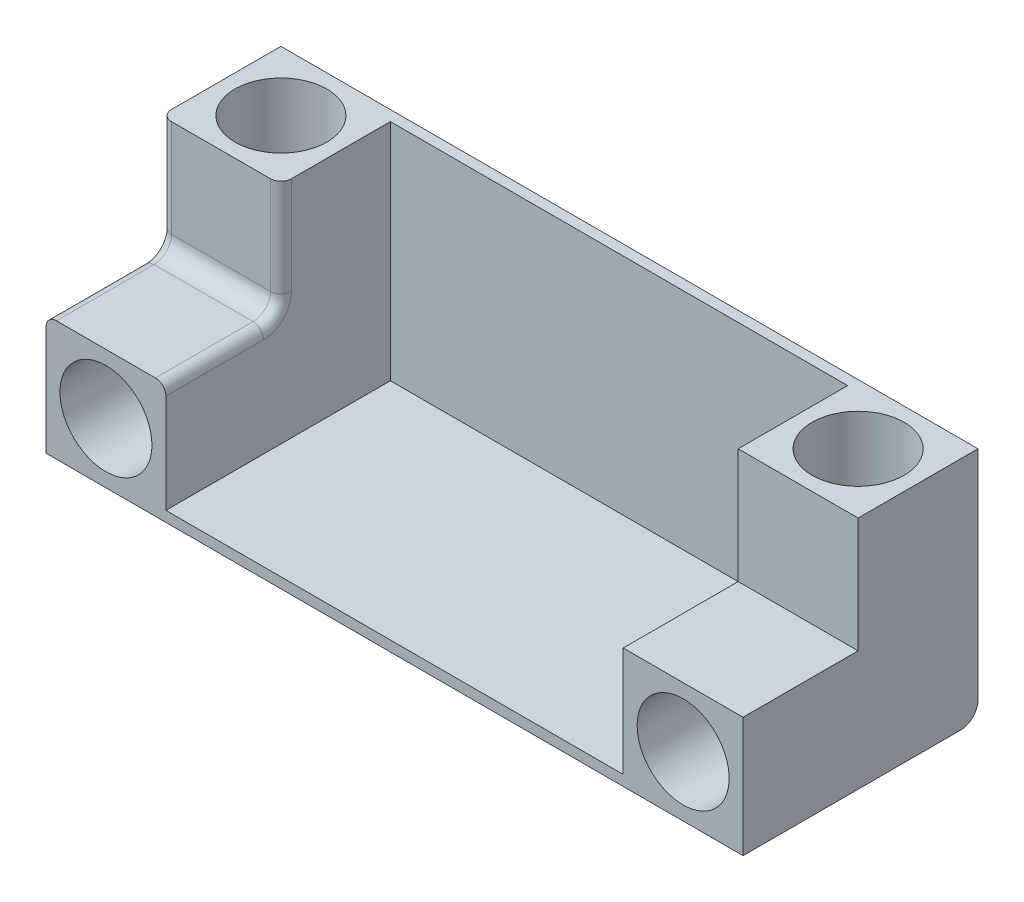
ISO-10303-21;
HEADER;
FILE_DESCRIPTION(('STEP AP214'),'2;1');
FILE_NAME('part.step','',(''),(''),'','','');
FILE_SCHEMA(('AUTOMOTIVE_DESIGN { 1 0 10303 214 1 1 1 1 }'));
ENDSEC;
DATA;
#1=APPLICATION_CONTEXT('core data for automotive mechanical design processes');
#2=APPLICATION_PROTOCOL_DEFINITION('international standard','automotive_design',2000,#1);
#3=PRODUCT_CONTEXT('',#1,'mechanical');
#4=PRODUCT('Part','Part','',(#3));
#5=PRODUCT_RELATED_PRODUCT_CATEGORY('part','',(#4));
#6=PRODUCT_DEFINITION_FORMATION('','',#4);
#7=PRODUCT_DEFINITION_CONTEXT('part definition',#1,'design');
#8=PRODUCT_DEFINITION('design','',#6,#7);
#9=PRODUCT_DEFINITION_SHAPE('','',#8);
#10=(LENGTH_UNIT() NAMED_UNIT(*) SI_UNIT(.MILLI.,.METRE.));
#11=(NAMED_UNIT(*) PLANE_ANGLE_UNIT() SI_UNIT($,.RADIAN.));
#12=(NAMED_UNIT(*) SI_UNIT($,.STERADIAN.) SOLID_ANGLE_UNIT());
#13=UNCERTAINTY_MEASURE_WITH_UNIT(LENGTH_MEASURE(1.E-05),#10,'distance_accuracy_value','');
#14=(GEOMETRIC_REPRESENTATION_CONTEXT(3) GLOBAL_UNCERTAINTY_ASSIGNED_CONTEXT((#13)) GLOBAL_UNIT_ASSIGNED_CONTEXT((#10,
#11,#12)) REPRESENTATION_CONTEXT('',''));
#15=CARTESIAN_POINT('',(0.,0.,0.));
#16=DIRECTION('',(0.,0.,1.));
#17=DIRECTION('',(1.,0.,0.));
#18=AXIS2_PLACEMENT_3D('',#15,#16,#17);
#19=CARTESIAN_POINT('',(150.,55.,0.));
#20=DIRECTION('',(-1.,0.,0.));
#21=DIRECTION('',(0.,0.,1.));
#22=AXIS2_PLACEMENT_3D('',#19,#20,#21);
#23=PLANE('',#22);
#24=DIRECTION('',(0.,0.,-1.));
#25=VECTOR('',#24,1.);
#26=CARTESIAN_POINT('',(150.,0.,0.));
#27=LINE('',#26,#25);
#28=CARTESIAN_POINT('',(150.,0.,39.8999999999999));
#29=VERTEX_POINT('',#28);
#30=CARTESIAN_POINT('',(150.,0.,-22.5));
#31=VERTEX_POINT('',#30);
#32=EDGE_CURVE('E166',#29,#31,#27,.T.);
#33=ORIENTED_EDGE('',*,*,#32,.T.);
#34=CARTESIAN_POINT('',(150.,5.,-22.5));
#35=DIRECTION('',(-1.,0.,0.));
#36=DIRECTION('',(0.,0.,1.));
#37=AXIS2_PLACEMENT_3D('',#34,#35,#36);
#38=CIRCLE('',#37,5.);
#39=CARTESIAN_POINT('',(150.,5.,-27.5000000000001));
#40=VERTEX_POINT('',#39);
#41=EDGE_CURVE('E282',#31,#40,#38,.F.);
#42=ORIENTED_EDGE('',*,*,#41,.T.);
#43=DIRECTION('',(0.,-1.,0.));
#44=VECTOR('',#43,1.);
#45=CARTESIAN_POINT('',(150.,55.,-27.5000000000001));
#46=LINE('',#45,#44);
#47=CARTESIAN_POINT('',(150.,67.4,-27.5000000000001));
#48=VERTEX_POINT('',#47);
#49=EDGE_CURVE('E175',#48,#40,#46,.T.);
#50=ORIENTED_EDGE('',*,*,#49,.F.);
#51=DIRECTION('',(0.,0.,1.));
#52=VECTOR('',#51,1.);
#53=CARTESIAN_POINT('',(150.,67.4,-27.5000000000001));
#54=LINE('',#53,#52);
#55=CARTESIAN_POINT('',(150.,67.4,6.89999999999988));
#56=VERTEX_POINT('',#55);
#57=EDGE_CURVE('E209',#48,#56,#54,.T.);
#58=ORIENTED_EDGE('',*,*,#57,.T.);
#59=DIRECTION('',(0.,-1.,0.));
#60=VECTOR('',#59,1.);
#61=CARTESIAN_POINT('',(150.,55.,6.89999999999988));
#62=LINE('',#61,#60);
#63=CARTESIAN_POINT('',(150.,34.4,6.89999999999989));
#64=VERTEX_POINT('',#63);
#65=EDGE_CURVE('E219',#56,#64,#62,.T.);
#66=ORIENTED_EDGE('',*,*,#65,.T.);
#67=DIRECTION('',(0.,0.,1.));
#68=VECTOR('',#67,1.);
#69=CARTESIAN_POINT('',(150.,34.4,27.4999999999999));
#70=LINE('',#69,#68);
#71=CARTESIAN_POINT('',(150.,34.4,39.8999999999999));
#72=VERTEX_POINT('',#71);
#73=EDGE_CURVE('E193',#64,#72,#70,.T.);
#74=ORIENTED_EDGE('',*,*,#73,.T.);
#75=DIRECTION('',(0.,-1.,0.));
#76=VECTOR('',#75,1.);
#77=CARTESIAN_POINT('',(150.,34.4,39.8999999999999));
#78=LINE('',#77,#76);
#79=EDGE_CURVE('E184',#72,#29,#78,.T.);
#80=ORIENTED_EDGE('',*,*,#79,.T.);
#81=EDGE_LOOP('',(#33,#42,#50,#58,#66,#74,#80));
#82=FACE_BOUND('',#81,.T.);
#83=ADVANCED_FACE('F37',(#82),#23,.F.);
#84=CARTESIAN_POINT('',(115.6,3.,-24.5000000000001));
#85=DIRECTION('',(-1.,0.,0.));
#86=DIRECTION('',(0.,0.,1.));
#87=AXIS2_PLACEMENT_3D('',#84,#85,#86);
#88=PLANE('',#87);
#89=DIRECTION('',(0.,0.,-1.));
#90=VECTOR('',#89,1.);
#91=CARTESIAN_POINT('',(115.6,34.4,-24.5000000000001));
#92=LINE('',#91,#90);
#93=CARTESIAN_POINT('',(115.6,34.4,39.8999999999999));
#94=VERTEX_POINT('',#93);
#95=CARTESIAN_POINT('',(115.6,34.4,6.89999999999989));
#96=VERTEX_POINT('',#95);
#97=EDGE_CURVE('E276',#94,#96,#92,.T.);
#98=ORIENTED_EDGE('',*,*,#97,.T.);
#99=DIRECTION('',(0.,1.,0.));
#100=VECTOR('',#99,1.);
#101=CARTESIAN_POINT('',(115.6,3.00000000000001,6.89999999999992));
#102=LINE('',#101,#100);
#103=CARTESIAN_POINT('',(115.6,67.4,6.89999999999992));
#104=VERTEX_POINT('',#103);
#105=EDGE_CURVE('E279',#96,#104,#102,.T.);
#106=ORIENTED_EDGE('',*,*,#105,.T.);
#107=DIRECTION('',(0.,0.,-1.));
#108=VECTOR('',#107,1.);
#109=CARTESIAN_POINT('',(115.6,67.4,6.89999999999992));
#110=LINE('',#109,#108);
#111=CARTESIAN_POINT('',(115.6,67.4,-24.5000000000001));
#112=VERTEX_POINT('',#111);
#113=EDGE_CURVE('E212',#104,#112,#110,.T.);
#114=ORIENTED_EDGE('',*,*,#113,.T.);
#115=DIRECTION('',(0.,1.,0.));
#116=VECTOR('',#115,1.);
#117=CARTESIAN_POINT('',(115.6,3.,-24.5000000000001));
#118=LINE('',#117,#116);
#119=CARTESIAN_POINT('',(115.6,3.,-24.5000000000001));
#120=VERTEX_POINT('',#119);
#121=EDGE_CURVE('E176',#120,#112,#118,.T.);
#122=ORIENTED_EDGE('',*,*,#121,.F.);
#123=DIRECTION('',(0.,0.,1.));
#124=VECTOR('',#123,1.);
#125=CARTESIAN_POINT('',(115.6,3.,-24.5000000000001));
#126=LINE('',#125,#124);
#127=CARTESIAN_POINT('',(115.6,3.,39.8999999999999));
#128=VERTEX_POINT('',#127);
#129=EDGE_CURVE('E226',#120,#128,#126,.T.);
#130=ORIENTED_EDGE('',*,*,#129,.T.);
#131=DIRECTION('',(0.,1.,0.));
#132=VECTOR('',#131,1.);
#133=CARTESIAN_POINT('',(115.6,3.,39.8999999999999));
#134=LINE('',#133,#132);
#135=EDGE_CURVE('E197',#128,#94,#134,.T.);
#136=ORIENTED_EDGE('',*,*,#135,.T.);
#137=EDGE_LOOP('',(#98,#106,#114,#122,#130,#136));
#138=FACE_BOUND('',#137,.T.);
#139=ADVANCED_FACE('F357',(#138),#88,.T.);
#140=CARTESIAN_POINT('',(0.,55.,-27.5));
#141=DIRECTION('',(0.,0.,-1.));
#142=DIRECTION('',(-1.,0.,0.));
#143=AXIS2_PLACEMENT_3D('',#140,#141,#142);
#144=PLANE('',#143);
#145=ORIENTED_EDGE('',*,*,#49,.T.);
#146=DIRECTION('',(1.,0.,0.));
#147=VECTOR('',#146,1.);
#148=CARTESIAN_POINT('',(-50.,5.,-27.5000000000001));
#149=LINE('',#148,#147);
#150=CARTESIAN_POINT('',(-50.,5.,-27.5000000000001));
#151=VERTEX_POINT('',#150);
#152=EDGE_CURVE('E284',#40,#151,#149,.F.);
#153=ORIENTED_EDGE('',*,*,#152,.T.);
#154=DIRECTION('',(0.,-1.,0.));
#155=VECTOR('',#154,1.);
#156=CARTESIAN_POINT('',(-50.,55.,-27.5000000000001));
#157=LINE('',#156,#155);
#158=CARTESIAN_POINT('',(-50.,67.4,-27.5000000000001));
#159=VERTEX_POINT('',#158);
#160=EDGE_CURVE('E270',#159,#151,#157,.T.);
#161=ORIENTED_EDGE('',*,*,#160,.F.);
#162=DIRECTION('',(-1.,0.,0.));
#163=VECTOR('',#162,1.);
#164=CARTESIAN_POINT('',(50.,67.4,-27.5));
#165=LINE('',#164,#163);
#166=EDGE_CURVE('E254',#48,#159,#165,.T.);
#167=ORIENTED_EDGE('',*,*,#166,.F.);
#168=EDGE_LOOP('',(#145,#153,#161,#167));
#169=FACE_BOUND('',#168,.T.);
#170=ADVANCED_FACE('F367',(#169),#144,.T.);
#171=CARTESIAN_POINT('',(-50.,55.,0.));
#172=DIRECTION('',(-1.,0.,0.));
#173=DIRECTION('',(0.,0.,1.));
#174=AXIS2_PLACEMENT_3D('',#171,#172,#173);
#175=PLANE('',#174);
#176=DIRECTION('',(0.,-1.,0.));
#177=VECTOR('',#176,1.);
#178=CARTESIAN_POINT('',(-50.,34.4,39.8999999999999));
#179=LINE('',#178,#177);
#180=CARTESIAN_POINT('',(-50.,31.4,39.8999999999999));
#181=VERTEX_POINT('',#180);
#182=CARTESIAN_POINT('',(-50.,0.,39.8999999999999));
#183=VERTEX_POINT('',#182);
#184=EDGE_CURVE('E187',#181,#183,#179,.T.);
#185=ORIENTED_EDGE('',*,*,#184,.F.);
#186=DIRECTION('',(0.,0.,1.));
#187=VECTOR('',#186,1.);
#188=CARTESIAN_POINT('',(-50.,31.4,11.8999999999999));
#189=LINE('',#188,#187);
#190=CARTESIAN_POINT('',(-50.,31.4,11.8999999999999));
#191=VERTEX_POINT('',#190);
#192=EDGE_CURVE('E301',#181,#191,#189,.F.);
#193=ORIENTED_EDGE('',*,*,#192,.T.);
#194=CARTESIAN_POINT('',(-50.,39.4,11.8999999999999));
#195=DIRECTION('',(-1.,0.,0.));
#196=DIRECTION('',(0.,0.,1.));
#197=AXIS2_PLACEMENT_3D('',#194,#195,#196);
#198=CIRCLE('',#197,8.);
#199=CARTESIAN_POINT('',(-50.,39.4,3.89999999999994));
#200=VERTEX_POINT('',#199);
#201=EDGE_CURVE('E299',#191,#200,#198,.F.);
#202=ORIENTED_EDGE('',*,*,#201,.T.);
#203=DIRECTION('',(0.,-1.,0.));
#204=VECTOR('',#203,1.);
#205=CARTESIAN_POINT('',(-50.,67.4,3.89999999999994));
#206=LINE('',#205,#204);
#207=CARTESIAN_POINT('',(-50.,67.4,3.89999999999992));
#208=VERTEX_POINT('',#207);
#209=EDGE_CURVE('E297',#200,#208,#206,.F.);
#210=ORIENTED_EDGE('',*,*,#209,.T.);
#211=DIRECTION('',(0.,0.,1.));
#212=VECTOR('',#211,1.);
#213=CARTESIAN_POINT('',(-50.,67.4,-27.5000000000001));
#214=LINE('',#213,#212);
#215=EDGE_CURVE('E244',#159,#208,#214,.T.);
#216=ORIENTED_EDGE('',*,*,#215,.F.);
#217=ORIENTED_EDGE('',*,*,#160,.T.);
#218=CARTESIAN_POINT('',(-50.,5.,-22.5000000000001));
#219=DIRECTION('',(-1.,0.,0.));
#220=DIRECTION('',(0.,0.,1.));
#221=AXIS2_PLACEMENT_3D('',#218,#219,#220);
#222=CIRCLE('',#221,5.);
#223=CARTESIAN_POINT('',(-50.,0.,-22.5000000000001));
#224=VERTEX_POINT('',#223);
#225=EDGE_CURVE('E286',#151,#224,#222,.T.);
#226=ORIENTED_EDGE('',*,*,#225,.T.);
#227=DIRECTION('',(0.,0.,-1.));
#228=VECTOR('',#227,1.);
#229=CARTESIAN_POINT('',(-50.,0.,0.));
#230=LINE('',#229,#228);
#231=EDGE_CURVE('E268',#183,#224,#230,.T.);
#232=ORIENTED_EDGE('',*,*,#231,.F.);
#233=EDGE_LOOP('',(#185,#193,#202,#210,#216,#217,#226,#232));
#234=FACE_BOUND('',#233,.T.);
#235=ADVANCED_FACE('F370',(#234),#175,.T.);
#236=CARTESIAN_POINT('',(0.,0.,0.));
#237=DIRECTION('',(0.,1.,0.));
#238=DIRECTION('',(0.,0.,1.));
#239=AXIS2_PLACEMENT_3D('',#236,#237,#238);
#240=PLANE('',#239);
#241=ORIENTED_EDGE('',*,*,#231,.T.);
#242=DIRECTION('',(1.,0.,0.));
#243=VECTOR('',#242,1.);
#244=CARTESIAN_POINT('',(150.,0.,-22.5));
#245=LINE('',#244,#243);
#246=EDGE_CURVE('E172',#224,#31,#245,.T.);
#247=ORIENTED_EDGE('',*,*,#246,.T.);
#248=ORIENTED_EDGE('',*,*,#32,.F.);
#249=DIRECTION('',(1.,0.,0.));
#250=VECTOR('',#249,1.);
#251=CARTESIAN_POINT('',(-50.,0.,39.8999999999999));
#252=LINE('',#251,#250);
#253=EDGE_CURVE('E170',#183,#29,#252,.T.);
#254=ORIENTED_EDGE('',*,*,#253,.F.);
#255=EDGE_LOOP('',(#241,#247,#248,#254));
#256=FACE_BOUND('',#255,.T.);
#257=ADVANCED_FACE('F169',(#256),#240,.F.);
#258=CARTESIAN_POINT('',(-15.6,3.,-24.5000000000001));
#259=DIRECTION('',(-1.,0.,0.));
#260=DIRECTION('',(0.,0.,1.));
#261=AXIS2_PLACEMENT_3D('',#258,#259,#260);
#262=PLANE('',#261);
#263=CARTESIAN_POINT('',(-15.6,39.4,11.9));
#264=DIRECTION('',(-1.,0.,0.));
#265=DIRECTION('',(0.,0.,1.));
#266=AXIS2_PLACEMENT_3D('',#263,#264,#265);
#267=CIRCLE('',#266,8.);
#268=CARTESIAN_POINT('',(-15.6,39.4,3.89999999999995));
#269=VERTEX_POINT('',#268);
#270=CARTESIAN_POINT('',(-15.6,31.4,11.9));
#271=VERTEX_POINT('',#270);
#272=EDGE_CURVE('E318',#269,#271,#267,.T.);
#273=ORIENTED_EDGE('',*,*,#272,.T.);
#274=DIRECTION('',(0.,0.,1.));
#275=VECTOR('',#274,1.);
#276=CARTESIAN_POINT('',(-15.6,31.4,-24.5000000000001));
#277=LINE('',#276,#275);
#278=CARTESIAN_POINT('',(-15.6,31.4,39.8999999999999));
#279=VERTEX_POINT('',#278);
#280=EDGE_CURVE('E320',#271,#279,#277,.T.);
#281=ORIENTED_EDGE('',*,*,#280,.T.);
#282=DIRECTION('',(0.,1.,0.));
#283=VECTOR('',#282,1.);
#284=CARTESIAN_POINT('',(-15.6,3.,39.8999999999999));
#285=LINE('',#284,#283);
#286=CARTESIAN_POINT('',(-15.6,3.,39.8999999999999));
#287=VERTEX_POINT('',#286);
#288=EDGE_CURVE('E237',#287,#279,#285,.T.);
#289=ORIENTED_EDGE('',*,*,#288,.F.);
#290=DIRECTION('',(0.,0.,1.));
#291=VECTOR('',#290,1.);
#292=CARTESIAN_POINT('',(-15.6,3.,-24.5000000000001));
#293=LINE('',#292,#291);
#294=CARTESIAN_POINT('',(-15.6,3.,-24.5000000000001));
#295=VERTEX_POINT('',#294);
#296=EDGE_CURVE('E260',#295,#287,#293,.T.);
#297=ORIENTED_EDGE('',*,*,#296,.F.);
#298=DIRECTION('',(0.,1.,0.));
#299=VECTOR('',#298,1.);
#300=CARTESIAN_POINT('',(-15.6,3.,-24.5000000000001));
#301=LINE('',#300,#299);
#302=CARTESIAN_POINT('',(-15.6,67.4,-24.5000000000001));
#303=VERTEX_POINT('',#302);
#304=EDGE_CURVE('E265',#295,#303,#301,.T.);
#305=ORIENTED_EDGE('',*,*,#304,.T.);
#306=DIRECTION('',(0.,0.,-1.));
#307=VECTOR('',#306,1.);
#308=CARTESIAN_POINT('',(-15.6,67.4,6.89999999999996));
#309=LINE('',#308,#307);
#310=CARTESIAN_POINT('',(-15.6,67.4,3.89999999999995));
#311=VERTEX_POINT('',#310);
#312=EDGE_CURVE('E249',#311,#303,#309,.T.);
#313=ORIENTED_EDGE('',*,*,#312,.F.);
#314=DIRECTION('',(0.,-1.,0.));
#315=VECTOR('',#314,1.);
#316=CARTESIAN_POINT('',(-15.6,3.00000000000001,3.89999999999996));
#317=LINE('',#316,#315);
#318=EDGE_CURVE('E310',#311,#269,#317,.T.);
#319=ORIENTED_EDGE('',*,*,#318,.T.);
#320=EDGE_LOOP('',(#273,#281,#289,#297,#305,#313,#319));
#321=FACE_BOUND('',#320,.T.);
#322=ADVANCED_FACE('F347',(#321),#262,.F.);
#323=CARTESIAN_POINT('',(-15.6,3.,-24.5000000000001));
#324=DIRECTION('',(0.,0.,-1.));
#325=DIRECTION('',(-1.,0.,0.));
#326=AXIS2_PLACEMENT_3D('',#323,#324,#325);
#327=PLANE('',#326);
#328=ORIENTED_EDGE('',*,*,#121,.T.);
#329=DIRECTION('',(1.,0.,0.));
#330=VECTOR('',#329,1.);
#331=CARTESIAN_POINT('',(-15.6,67.4,-24.5000000000001));
#332=LINE('',#331,#330);
#333=EDGE_CURVE('E251',#303,#112,#332,.T.);
#334=ORIENTED_EDGE('',*,*,#333,.F.);
#335=ORIENTED_EDGE('',*,*,#304,.F.);
#336=DIRECTION('',(-1.,0.,0.));
#337=VECTOR('',#336,1.);
#338=CARTESIAN_POINT('',(-15.6,3.,-24.5000000000001));
#339=LINE('',#338,#337);
#340=EDGE_CURVE('E262',#120,#295,#339,.T.);
#341=ORIENTED_EDGE('',*,*,#340,.F.);
#342=EDGE_LOOP('',(#328,#334,#335,#341));
#343=FACE_BOUND('',#342,.T.);
#344=ADVANCED_FACE('F352',(#343),#327,.F.);
#345=CARTESIAN_POINT('',(0.,3.,0.));
#346=DIRECTION('',(0.,1.,0.));
#347=DIRECTION('',(0.,0.,1.));
#348=AXIS2_PLACEMENT_3D('',#345,#346,#347);
#349=PLANE('',#348);
#350=ORIENTED_EDGE('',*,*,#296,.T.);
#351=DIRECTION('',(-1.,0.,0.));
#352=VECTOR('',#351,1.);
#353=CARTESIAN_POINT('',(50.,3.,39.8999999999999));
#354=LINE('',#353,#352);
#355=EDGE_CURVE('E234',#128,#287,#354,.T.);
#356=ORIENTED_EDGE('',*,*,#355,.F.);
#357=ORIENTED_EDGE('',*,*,#129,.F.);
#358=ORIENTED_EDGE('',*,*,#340,.T.);
#359=EDGE_LOOP('',(#350,#356,#357,#358));
#360=FACE_BOUND('',#359,.T.);
#361=ADVANCED_FACE('F411',(#360),#349,.T.);
#362=CARTESIAN_POINT('',(-11.,34.4,27.5));
#363=DIRECTION('',(0.,-1.,0.));
#364=DIRECTION('',(0.,0.,-1.));
#365=AXIS2_PLACEMENT_3D('',#362,#363,#364);
#366=PLANE('',#365);
#367=DIRECTION('',(-1.,0.,0.));
#368=VECTOR('',#367,1.);
#369=CARTESIAN_POINT('',(-15.6,34.4,39.8999999999999));
#370=LINE('',#369,#368);
#371=CARTESIAN_POINT('',(-18.6,34.4,39.8999999999999));
#372=VERTEX_POINT('',#371);
#373=CARTESIAN_POINT('',(-47.,34.4,39.8999999999999));
#374=VERTEX_POINT('',#373);
#375=EDGE_CURVE('E239',#372,#374,#370,.T.);
#376=ORIENTED_EDGE('',*,*,#375,.F.);
#377=DIRECTION('',(0.,0.,1.));
#378=VECTOR('',#377,1.);
#379=CARTESIAN_POINT('',(-18.6,34.4,27.5));
#380=LINE('',#379,#378);
#381=CARTESIAN_POINT('',(-18.6,34.4,11.9));
#382=VERTEX_POINT('',#381);
#383=EDGE_CURVE('E325',#372,#382,#380,.F.);
#384=ORIENTED_EDGE('',*,*,#383,.T.);
#385=DIRECTION('',(-1.,0.,0.));
#386=VECTOR('',#385,1.);
#387=CARTESIAN_POINT('',(-50.,34.4,11.8999999999999));
#388=LINE('',#387,#386);
#389=CARTESIAN_POINT('',(-47.,34.4,11.8999999999999));
#390=VERTEX_POINT('',#389);
#391=EDGE_CURVE('E288',#382,#390,#388,.T.);
#392=ORIENTED_EDGE('',*,*,#391,.T.);
#393=DIRECTION('',(0.,0.,1.));
#394=VECTOR('',#393,1.);
#395=CARTESIAN_POINT('',(-47.,34.4,39.8999999999999));
#396=LINE('',#395,#394);
#397=EDGE_CURVE('E292',#390,#374,#396,.T.);
#398=ORIENTED_EDGE('',*,*,#397,.T.);
#399=EDGE_LOOP('',(#376,#384,#392,#398));
#400=FACE_BOUND('',#399,.T.);
#401=ADVANCED_FACE('F408',(#400),#366,.F.);
#402=CARTESIAN_POINT('',(-11.,55.,6.89999999999996));
#403=DIRECTION('',(0.,0.,-1.));
#404=DIRECTION('',(-1.,0.,0.));
#405=AXIS2_PLACEMENT_3D('',#402,#403,#404);
#406=PLANE('',#405);
#407=DIRECTION('',(-1.,0.,0.));
#408=VECTOR('',#407,1.);
#409=CARTESIAN_POINT('',(-15.6,39.4,6.89999999999996));
#410=LINE('',#409,#408);
#411=CARTESIAN_POINT('',(-47.,39.4,6.89999999999994));
#412=VERTEX_POINT('',#411);
#413=CARTESIAN_POINT('',(-18.6,39.4,6.89999999999996));
#414=VERTEX_POINT('',#413);
#415=EDGE_CURVE('E290',#412,#414,#410,.F.);
#416=ORIENTED_EDGE('',*,*,#415,.T.);
#417=DIRECTION('',(0.,-1.,0.));
#418=VECTOR('',#417,1.);
#419=CARTESIAN_POINT('',(-18.6,55.,6.89999999999995));
#420=LINE('',#419,#418);
#421=CARTESIAN_POINT('',(-18.6,67.4,6.89999999999995));
#422=VERTEX_POINT('',#421);
#423=EDGE_CURVE('E46',#414,#422,#420,.F.);
#424=ORIENTED_EDGE('',*,*,#423,.T.);
#425=DIRECTION('',(1.,0.,0.));
#426=VECTOR('',#425,1.);
#427=CARTESIAN_POINT('',(-50.,67.4,6.89999999999994));
#428=LINE('',#427,#426);
#429=CARTESIAN_POINT('',(-47.,67.4,6.89999999999994));
#430=VERTEX_POINT('',#429);
#431=EDGE_CURVE('E247',#430,#422,#428,.T.);
#432=ORIENTED_EDGE('',*,*,#431,.F.);
#433=DIRECTION('',(0.,-1.,0.));
#434=VECTOR('',#433,1.);
#435=CARTESIAN_POINT('',(-47.,39.4,6.89999999999994));
#436=LINE('',#435,#434);
#437=EDGE_CURVE('E306',#430,#412,#436,.T.);
#438=ORIENTED_EDGE('',*,*,#437,.T.);
#439=EDGE_LOOP('',(#416,#424,#432,#438));
#440=FACE_BOUND('',#439,.T.);
#441=ADVANCED_FACE('F407',(#440),#406,.F.);
#442=CARTESIAN_POINT('',(0.,67.4,0.));
#443=DIRECTION('',(0.,1.,0.));
#444=DIRECTION('',(0.,0.,1.));
#445=AXIS2_PLACEMENT_3D('',#442,#443,#444);
#446=PLANE('',#445);
#447=ORIENTED_EDGE('',*,*,#431,.T.);
#448=CARTESIAN_POINT('',(-18.6,67.4,3.89999999999995));
#449=DIRECTION('',(0.,1.,0.));
#450=DIRECTION('',(0.,0.,1.));
#451=AXIS2_PLACEMENT_3D('',#448,#449,#450);
#452=CIRCLE('',#451,3.);
#453=EDGE_CURVE('E11',#422,#311,#452,.T.);
#454=ORIENTED_EDGE('',*,*,#453,.T.);
#455=ORIENTED_EDGE('',*,*,#312,.T.);
#456=ORIENTED_EDGE('',*,*,#333,.T.);
#457=ORIENTED_EDGE('',*,*,#113,.F.);
#458=DIRECTION('',(-1.,0.,0.));
#459=VECTOR('',#458,1.);
#460=CARTESIAN_POINT('',(150.,67.4,6.89999999999988));
#461=LINE('',#460,#459);
#462=EDGE_CURVE('E215',#56,#104,#461,.T.);
#463=ORIENTED_EDGE('',*,*,#462,.F.);
#464=ORIENTED_EDGE('',*,*,#57,.F.);
#465=ORIENTED_EDGE('',*,*,#166,.T.);
#466=ORIENTED_EDGE('',*,*,#215,.T.);
#467=CARTESIAN_POINT('',(-47.,67.4,3.89999999999994));
#468=DIRECTION('',(0.,1.,0.));
#469=DIRECTION('',(0.,0.,1.));
#470=AXIS2_PLACEMENT_3D('',#467,#468,#469);
#471=CIRCLE('',#470,3.);
#472=EDGE_CURVE('E308',#208,#430,#471,.T.);
#473=ORIENTED_EDGE('',*,*,#472,.T.);
#474=EDGE_LOOP('',(#447,#454,#455,#456,#457,#463,#464,#465,#466,#473));
#475=FACE_BOUND('',#474,.T.);
#476=CARTESIAN_POINT('',(-32.8,67.4,-10.3000000000001));
#477=DIRECTION('',(0.,1.,0.));
#478=DIRECTION('',(0.,0.,1.));
#479=AXIS2_PLACEMENT_3D('',#476,#477,#478);
#480=CIRCLE('',#479,13.2);
#481=CARTESIAN_POINT('',(-32.8,67.4,2.89999999999995));
#482=VERTEX_POINT('',#481);
#483=EDGE_CURVE('E189',#482,#482,#480,.T.);
#484=ORIENTED_EDGE('',*,*,#483,.F.);
#485=EDGE_LOOP('',(#484));
#486=FACE_BOUND('',#485,.T.);
#487=CARTESIAN_POINT('',(132.8,67.4,-10.3000000000001));
#488=DIRECTION('',(0.,-1.,0.));
#489=DIRECTION('',(0.,0.,1.));
#490=AXIS2_PLACEMENT_3D('',#487,#488,#489);
#491=CIRCLE('',#490,13.2);
#492=CARTESIAN_POINT('',(132.8,67.4,2.8999999999999));
#493=VERTEX_POINT('',#492);
#494=EDGE_CURVE('E206',#493,#493,#491,.T.);
#495=ORIENTED_EDGE('',*,*,#494,.T.);
#496=EDGE_LOOP('',(#495));
#497=FACE_BOUND('',#496,.T.);
#498=ADVANCED_FACE('F344',(#475,#486,#497),#446,.T.);
#499=CARTESIAN_POINT('',(0.,5.,0.));
#500=DIRECTION('',(0.,1.,0.));
#501=DIRECTION('',(0.,0.,1.));
#502=AXIS2_PLACEMENT_3D('',#499,#500,#501);
#503=PLANE('',#502);
#504=CARTESIAN_POINT('',(-32.8,5.,-10.3000000000001));
#505=DIRECTION('',(0.,1.,0.));
#506=DIRECTION('',(0.,0.,1.));
#507=AXIS2_PLACEMENT_3D('',#504,#505,#506);
#508=CIRCLE('',#507,13.2);
#509=CARTESIAN_POINT('',(-32.8,5.,2.89999999999995));
#510=VERTEX_POINT('',#509);
#511=EDGE_CURVE('E273',#510,#510,#508,.F.);
#512=ORIENTED_EDGE('',*,*,#511,.F.);
#513=EDGE_LOOP('',(#512));
#514=FACE_BOUND('',#513,.T.);
#515=ADVANCED_FACE('F406',(#514),#503,.T.);
#516=CARTESIAN_POINT('',(-32.8,55.,-10.3000000000001));
#517=DIRECTION('',(0.,-1.,0.));
#518=DIRECTION('',(0.,0.,-1.));
#519=AXIS2_PLACEMENT_3D('',#516,#517,#518);
#520=CYLINDRICAL_SURFACE('',#519,13.2);
#521=ORIENTED_EDGE('',*,*,#511,.T.);
#522=EDGE_LOOP('',(#521));
#523=FACE_BOUND('',#522,.T.);
#524=ORIENTED_EDGE('',*,*,#483,.T.);
#525=EDGE_LOOP('',(#524));
#526=FACE_BOUND('',#525,.T.);
#527=ADVANCED_FACE('F403',(#523,#526),#520,.F.);
#528=CARTESIAN_POINT('',(0.,0.,39.8999999999999));
#529=DIRECTION('',(0.,0.,-1.));
#530=DIRECTION('',(-1.,0.,0.));
#531=AXIS2_PLACEMENT_3D('',#528,#529,#530);
#532=PLANE('',#531);
#533=ORIENTED_EDGE('',*,*,#288,.T.);
#534=CARTESIAN_POINT('',(-18.6,31.4,39.8999999999999));
#535=DIRECTION('',(0.,0.,-1.));
#536=DIRECTION('',(-1.,0.,0.));
#537=AXIS2_PLACEMENT_3D('',#534,#535,#536);
#538=CIRCLE('',#537,3.);
#539=EDGE_CURVE('E323',#279,#372,#538,.F.);
#540=ORIENTED_EDGE('',*,*,#539,.T.);
#541=ORIENTED_EDGE('',*,*,#375,.T.);
#542=CARTESIAN_POINT('',(-47.,31.4,39.8999999999999));
#543=DIRECTION('',(0.,0.,-1.));
#544=DIRECTION('',(-1.,0.,0.));
#545=AXIS2_PLACEMENT_3D('',#542,#543,#544);
#546=CIRCLE('',#545,3.);
#547=EDGE_CURVE('E295',#374,#181,#546,.F.);
#548=ORIENTED_EDGE('',*,*,#547,.T.);
#549=ORIENTED_EDGE('',*,*,#184,.T.);
#550=ORIENTED_EDGE('',*,*,#253,.T.);
#551=ORIENTED_EDGE('',*,*,#79,.F.);
#552=DIRECTION('',(1.,0.,0.));
#553=VECTOR('',#552,1.);
#554=CARTESIAN_POINT('',(115.6,34.4,39.8999999999999));
#555=LINE('',#554,#553);
#556=EDGE_CURVE('E194',#94,#72,#555,.T.);
#557=ORIENTED_EDGE('',*,*,#556,.F.);
#558=ORIENTED_EDGE('',*,*,#135,.F.);
#559=ORIENTED_EDGE('',*,*,#355,.T.);
#560=EDGE_LOOP('',(#533,#540,#541,#548,#549,#550,#551,#557,#558,#559));
#561=FACE_BOUND('',#560,.T.);
#562=CARTESIAN_POINT('',(-32.801538643648,17.198461356352,39.8999999999999));
#563=DIRECTION('',(0.,0.,1.));
#564=DIRECTION('',(1.,0.,0.));
#565=AXIS2_PLACEMENT_3D('',#562,#563,#564);
#566=CIRCLE('',#565,13.2);
#567=CARTESIAN_POINT('',(-19.601538643648,17.198461356352,39.8999999999999));
#568=VERTEX_POINT('',#567);
#569=EDGE_CURVE('E231',#568,#568,#566,.T.);
#570=ORIENTED_EDGE('',*,*,#569,.F.);
#571=EDGE_LOOP('',(#570));
#572=FACE_BOUND('',#571,.T.);
#573=CARTESIAN_POINT('',(132.801538643648,17.198461356352,39.8999999999999));
#574=DIRECTION('',(0.,0.,-1.));
#575=DIRECTION('',(-1.,0.,0.));
#576=AXIS2_PLACEMENT_3D('',#573,#574,#575);
#577=CIRCLE('',#576,13.2);
#578=CARTESIAN_POINT('',(119.601538643648,17.198461356352,39.8999999999999));
#579=VERTEX_POINT('',#578);
#580=EDGE_CURVE('E195',#579,#579,#577,.T.);
#581=ORIENTED_EDGE('',*,*,#580,.T.);
#582=EDGE_LOOP('',(#581));
#583=FACE_BOUND('',#582,.T.);
#584=ADVANCED_FACE('F181',(#561,#572,#583),#532,.F.);
#585=CARTESIAN_POINT('',(-32.801538643648,17.198461356352,4.89999999999993));
#586=DIRECTION('',(0.,0.,1.));
#587=DIRECTION('',(1.,0.,0.));
#588=AXIS2_PLACEMENT_3D('',#585,#586,#587);
#589=PLANE('',#588);
#590=CARTESIAN_POINT('',(-32.801538643648,17.198461356352,4.89999999999993));
#591=DIRECTION('',(0.,0.,1.));
#592=DIRECTION('',(1.,0.,0.));
#593=AXIS2_PLACEMENT_3D('',#590,#591,#592);
#594=CIRCLE('',#593,13.2);
#595=CARTESIAN_POINT('',(-19.601538643648,17.198461356352,4.89999999999993));
#596=VERTEX_POINT('',#595);
#597=EDGE_CURVE('E257',#596,#596,#594,.T.);
#598=ORIENTED_EDGE('',*,*,#597,.T.);
#599=EDGE_LOOP('',(#598));
#600=FACE_BOUND('',#599,.T.);
#601=ADVANCED_FACE('F402',(#600),#589,.T.);
#602=CARTESIAN_POINT('',(-32.801538643648,17.198461356352,4.89999999999993));
#603=DIRECTION('',(0.,0.,1.));
#604=DIRECTION('',(1.,0.,0.));
#605=AXIS2_PLACEMENT_3D('',#602,#603,#604);
#606=CYLINDRICAL_SURFACE('',#605,13.2);
#607=ORIENTED_EDGE('',*,*,#597,.F.);
#608=EDGE_LOOP('',(#607));
#609=FACE_BOUND('',#608,.T.);
#610=ORIENTED_EDGE('',*,*,#569,.T.);
#611=EDGE_LOOP('',(#610));
#612=FACE_BOUND('',#611,.T.);
#613=ADVANCED_FACE('F398',(#609,#612),#606,.F.);
#614=CARTESIAN_POINT('',(132.8,55.,-10.3000000000001));
#615=DIRECTION('',(0.,-1.,0.));
#616=DIRECTION('',(0.,0.,-1.));
#617=AXIS2_PLACEMENT_3D('',#614,#615,#616);
#618=CYLINDRICAL_SURFACE('',#617,13.2);
#619=CARTESIAN_POINT('',(132.8,5.,-10.3000000000001));
#620=DIRECTION('',(0.,-1.,0.));
#621=DIRECTION('',(0.,0.,1.));
#622=AXIS2_PLACEMENT_3D('',#619,#620,#621);
#623=CIRCLE('',#622,13.2);
#624=CARTESIAN_POINT('',(132.8,5.,2.8999999999999));
#625=VERTEX_POINT('',#624);
#626=EDGE_CURVE('E200',#625,#625,#623,.T.);
#627=ORIENTED_EDGE('',*,*,#626,.T.);
#628=EDGE_LOOP('',(#627));
#629=FACE_BOUND('',#628,.T.);
#630=ORIENTED_EDGE('',*,*,#494,.F.);
#631=EDGE_LOOP('',(#630));
#632=FACE_BOUND('',#631,.T.);
#633=ADVANCED_FACE('F395',(#629,#632),#618,.F.);
#634=CARTESIAN_POINT('',(111.,55.,6.89999999999992));
#635=DIRECTION('',(0.,0.,1.));
#636=DIRECTION('',(1.,0.,0.));
#637=AXIS2_PLACEMENT_3D('',#634,#635,#636);
#638=PLANE('',#637);
#639=DIRECTION('',(1.,0.,0.));
#640=VECTOR('',#639,1.);
#641=CARTESIAN_POINT('',(111.,34.4,6.89999999999993));
#642=LINE('',#641,#640);
#643=EDGE_CURVE('E221',#96,#64,#642,.T.);
#644=ORIENTED_EDGE('',*,*,#643,.T.);
#645=ORIENTED_EDGE('',*,*,#65,.F.);
#646=ORIENTED_EDGE('',*,*,#462,.T.);
#647=ORIENTED_EDGE('',*,*,#105,.F.);
#648=EDGE_LOOP('',(#644,#645,#646,#647));
#649=FACE_BOUND('',#648,.T.);
#650=ADVANCED_FACE('F361',(#649),#638,.T.);
#651=CARTESIAN_POINT('',(111.,34.4,27.4999999999999));
#652=DIRECTION('',(0.,1.,0.));
#653=DIRECTION('',(0.,0.,1.));
#654=AXIS2_PLACEMENT_3D('',#651,#652,#653);
#655=PLANE('',#654);
#656=ORIENTED_EDGE('',*,*,#97,.F.);
#657=ORIENTED_EDGE('',*,*,#556,.T.);
#658=ORIENTED_EDGE('',*,*,#73,.F.);
#659=ORIENTED_EDGE('',*,*,#643,.F.);
#660=EDGE_LOOP('',(#656,#657,#658,#659));
#661=FACE_BOUND('',#660,.T.);
#662=ADVANCED_FACE('F502',(#661),#655,.T.);
#663=CARTESIAN_POINT('',(132.801538643648,17.198461356352,4.89999999999988));
#664=DIRECTION('',(0.,0.,1.));
#665=DIRECTION('',(-1.,0.,0.));
#666=AXIS2_PLACEMENT_3D('',#663,#664,#665);
#667=PLANE('',#666);
#668=CARTESIAN_POINT('',(132.801538643648,17.198461356352,4.89999999999988));
#669=DIRECTION('',(0.,0.,-1.));
#670=DIRECTION('',(-1.,0.,0.));
#671=AXIS2_PLACEMENT_3D('',#668,#669,#670);
#672=CIRCLE('',#671,13.2);
#673=CARTESIAN_POINT('',(119.601538643648,17.198461356352,4.89999999999989));
#674=VERTEX_POINT('',#673);
#675=EDGE_CURVE('E223',#674,#674,#672,.T.);
#676=ORIENTED_EDGE('',*,*,#675,.F.);
#677=EDGE_LOOP('',(#676));
#678=FACE_BOUND('',#677,.T.);
#679=ADVANCED_FACE('F509',(#678),#667,.T.);
#680=CARTESIAN_POINT('',(132.801538643648,17.198461356352,4.89999999999988));
#681=DIRECTION('',(0.,0.,1.));
#682=DIRECTION('',(1.,0.,0.));
#683=AXIS2_PLACEMENT_3D('',#680,#681,#682);
#684=CYLINDRICAL_SURFACE('',#683,13.2);
#685=ORIENTED_EDGE('',*,*,#675,.T.);
#686=EDGE_LOOP('',(#685));
#687=FACE_BOUND('',#686,.T.);
#688=ORIENTED_EDGE('',*,*,#580,.F.);
#689=EDGE_LOOP('',(#688));
#690=FACE_BOUND('',#689,.T.);
#691=ADVANCED_FACE('F383',(#687,#690),#684,.F.);
#692=CARTESIAN_POINT('',(100.,5.,0.));
#693=DIRECTION('',(0.,1.,0.));
#694=DIRECTION('',(0.,0.,1.));
#695=AXIS2_PLACEMENT_3D('',#692,#693,#694);
#696=PLANE('',#695);
#697=ORIENTED_EDGE('',*,*,#626,.F.);
#698=EDGE_LOOP('',(#697));
#699=FACE_BOUND('',#698,.T.);
#700=ADVANCED_FACE('F375',(#699),#696,.T.);
#701=CARTESIAN_POINT('',(0.,5.,-22.5));
#702=DIRECTION('',(-1.,0.,0.));
#703=DIRECTION('',(0.,0.,1.));
#704=AXIS2_PLACEMENT_3D('',#701,#702,#703);
#705=CYLINDRICAL_SURFACE('',#704,5.);
#706=ORIENTED_EDGE('',*,*,#225,.F.);
#707=ORIENTED_EDGE('',*,*,#152,.F.);
#708=ORIENTED_EDGE('',*,*,#41,.F.);
#709=ORIENTED_EDGE('',*,*,#246,.F.);
#710=EDGE_LOOP('',(#706,#707,#708,#709));
#711=FACE_BOUND('',#710,.T.);
#712=ADVANCED_FACE('F372',(#711),#705,.T.);
#713=CARTESIAN_POINT('',(-11.,39.4,11.9));
#714=DIRECTION('',(1.,0.,0.));
#715=DIRECTION('',(0.,0.,-1.));
#716=AXIS2_PLACEMENT_3D('',#713,#714,#715);
#717=CYLINDRICAL_SURFACE('',#716,5.);
#718=ORIENTED_EDGE('',*,*,#391,.F.);
#719=CARTESIAN_POINT('',(-18.6,39.4,11.9));
#720=DIRECTION('',(-1.,0.,0.));
#721=DIRECTION('',(0.,0.,1.));
#722=AXIS2_PLACEMENT_3D('',#719,#720,#721);
#723=CIRCLE('',#722,5.);
#724=EDGE_CURVE('E61',#382,#414,#723,.F.);
#725=ORIENTED_EDGE('',*,*,#724,.T.);
#726=ORIENTED_EDGE('',*,*,#415,.F.);
#727=CARTESIAN_POINT('',(-47.,39.4,11.8999999999999));
#728=DIRECTION('',(-1.,0.,0.));
#729=DIRECTION('',(0.,0.,1.));
#730=AXIS2_PLACEMENT_3D('',#727,#728,#729);
#731=CIRCLE('',#730,5.);
#732=EDGE_CURVE('E303',#412,#390,#731,.T.);
#733=ORIENTED_EDGE('',*,*,#732,.T.);
#734=EDGE_LOOP('',(#718,#725,#726,#733));
#735=FACE_BOUND('',#734,.T.);
#736=ADVANCED_FACE('F374',(#735),#717,.F.);
#737=CARTESIAN_POINT('',(-47.,55.,3.89999999999994));
#738=DIRECTION('',(0.,1.,0.));
#739=DIRECTION('',(0.,0.,1.));
#740=AXIS2_PLACEMENT_3D('',#737,#738,#739);
#741=CYLINDRICAL_SURFACE('',#740,3.);
#742=ORIENTED_EDGE('',*,*,#472,.F.);
#743=ORIENTED_EDGE('',*,*,#209,.F.);
#744=CARTESIAN_POINT('',(-47.,39.4,3.89999999999994));
#745=DIRECTION('',(0.,-1.,0.));
#746=DIRECTION('',(0.,0.,-1.));
#747=AXIS2_PLACEMENT_3D('',#744,#745,#746);
#748=CIRCLE('',#747,3.);
#749=EDGE_CURVE('E314',#412,#200,#748,.T.);
#750=ORIENTED_EDGE('',*,*,#749,.F.);
#751=ORIENTED_EDGE('',*,*,#437,.F.);
#752=EDGE_LOOP('',(#742,#743,#750,#751));
#753=FACE_BOUND('',#752,.T.);
#754=ADVANCED_FACE('F381',(#753),#741,.T.);
#755=CARTESIAN_POINT('',(-47.,39.4,11.8999999999999));
#756=DIRECTION('',(-1.,0.,0.));
#757=DIRECTION('',(0.,0.,1.));
#758=AXIS2_PLACEMENT_3D('',#755,#756,#757);
#759=TOROIDAL_SURFACE('',#758,8.,3.);
#760=ORIENTED_EDGE('',*,*,#749,.T.);
#761=ORIENTED_EDGE('',*,*,#201,.F.);
#762=CARTESIAN_POINT('',(-47.,31.4,11.8999999999999));
#763=DIRECTION('',(0.,0.,1.));
#764=DIRECTION('',(1.,0.,0.));
#765=AXIS2_PLACEMENT_3D('',#762,#763,#764);
#766=CIRCLE('',#765,3.);
#767=EDGE_CURVE('E311',#390,#191,#766,.T.);
#768=ORIENTED_EDGE('',*,*,#767,.F.);
#769=ORIENTED_EDGE('',*,*,#732,.F.);
#770=EDGE_LOOP('',(#760,#761,#768,#769));
#771=FACE_BOUND('',#770,.T.);
#772=ADVANCED_FACE('F689',(#771),#759,.T.);
#773=CARTESIAN_POINT('',(-47.,31.4,27.4999999999999));
#774=DIRECTION('',(0.,0.,-1.));
#775=DIRECTION('',(-1.,0.,0.));
#776=AXIS2_PLACEMENT_3D('',#773,#774,#775);
#777=CYLINDRICAL_SURFACE('',#776,3.);
#778=ORIENTED_EDGE('',*,*,#767,.T.);
#779=ORIENTED_EDGE('',*,*,#192,.F.);
#780=ORIENTED_EDGE('',*,*,#547,.F.);
#781=ORIENTED_EDGE('',*,*,#397,.F.);
#782=EDGE_LOOP('',(#778,#779,#780,#781));
#783=FACE_BOUND('',#782,.T.);
#784=ADVANCED_FACE('F699',(#783),#777,.T.);
#785=CARTESIAN_POINT('',(-18.6,3.00000000000001,3.89999999999996));
#786=DIRECTION('',(0.,-1.,0.));
#787=DIRECTION('',(0.,0.,-1.));
#788=AXIS2_PLACEMENT_3D('',#785,#786,#787);
#789=CYLINDRICAL_SURFACE('',#788,3.);
#790=ORIENTED_EDGE('',*,*,#453,.F.);
#791=ORIENTED_EDGE('',*,*,#423,.F.);
#792=CARTESIAN_POINT('',(-18.6,39.4,3.89999999999995));
#793=DIRECTION('',(0.,-1.,0.));
#794=DIRECTION('',(0.,0.,-1.));
#795=AXIS2_PLACEMENT_3D('',#792,#793,#794);
#796=CIRCLE('',#795,3.);
#797=EDGE_CURVE('E41',#269,#414,#796,.T.);
#798=ORIENTED_EDGE('',*,*,#797,.F.);
#799=ORIENTED_EDGE('',*,*,#318,.F.);
#800=EDGE_LOOP('',(#790,#791,#798,#799));
#801=FACE_BOUND('',#800,.T.);
#802=ADVANCED_FACE('F39',(#801),#789,.T.);
#803=CARTESIAN_POINT('',(-18.6,39.4,11.9));
#804=DIRECTION('',(-1.,0.,0.));
#805=DIRECTION('',(0.,0.,1.));
#806=AXIS2_PLACEMENT_3D('',#803,#804,#805);
#807=TOROIDAL_SURFACE('',#806,8.,3.);
#808=ORIENTED_EDGE('',*,*,#797,.T.);
#809=ORIENTED_EDGE('',*,*,#724,.F.);
#810=CARTESIAN_POINT('',(-18.6,31.4,11.9));
#811=DIRECTION('',(0.,0.,1.));
#812=DIRECTION('',(1.,0.,0.));
#813=AXIS2_PLACEMENT_3D('',#810,#811,#812);
#814=CIRCLE('',#813,3.);
#815=EDGE_CURVE('E328',#271,#382,#814,.T.);
#816=ORIENTED_EDGE('',*,*,#815,.F.);
#817=ORIENTED_EDGE('',*,*,#272,.F.);
#818=EDGE_LOOP('',(#808,#809,#816,#817));
#819=FACE_BOUND('',#818,.T.);
#820=ADVANCED_FACE('F338',(#819),#807,.T.);
#821=CARTESIAN_POINT('',(-18.6,31.4,-24.5000000000001));
#822=DIRECTION('',(0.,0.,1.));
#823=DIRECTION('',(1.,0.,0.));
#824=AXIS2_PLACEMENT_3D('',#821,#822,#823);
#825=CYLINDRICAL_SURFACE('',#824,3.);
#826=ORIENTED_EDGE('',*,*,#815,.T.);
#827=ORIENTED_EDGE('',*,*,#383,.F.);
#828=ORIENTED_EDGE('',*,*,#539,.F.);
#829=ORIENTED_EDGE('',*,*,#280,.F.);
#830=EDGE_LOOP('',(#826,#827,#828,#829));
#831=FACE_BOUND('',#830,.T.);
#832=ADVANCED_FACE('F723',(#831),#825,.T.);
#833=CLOSED_SHELL('',(#83,#139,#170,#235,#257,#322,#344,#361,#401,#441,#498,#515,#527,#584,#601,
#613,#633,#650,#662,#679,#691,#700,#712,#736,#754,#772,#784,#802,#820,#832));
#834=MANIFOLD_SOLID_BREP('B2',#833);
#835=ADVANCED_BREP_SHAPE_REPRESENTATION('',(#18,#834),#14);
#836=SHAPE_DEFINITION_REPRESENTATION(#9,#835);
ENDSEC;
END-ISO-10303-21;
